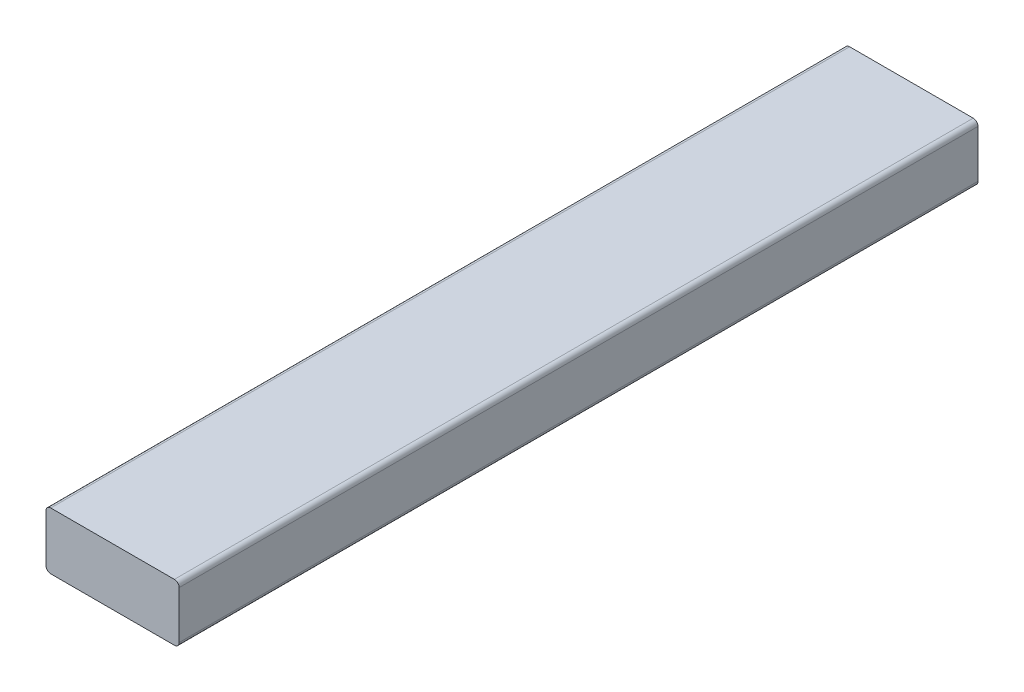
ISO-10303-21;
HEADER;
FILE_DESCRIPTION(('STEP AP214'),'2;1');
FILE_NAME('part.step','',(''),(''),'','','');
FILE_SCHEMA(('AUTOMOTIVE_DESIGN { 1 0 10303 214 1 1 1 1 }'));
ENDSEC;
DATA;
#1=APPLICATION_CONTEXT('core data for automotive mechanical design processes');
#2=APPLICATION_PROTOCOL_DEFINITION('international standard','automotive_design',2000,#1);
#3=PRODUCT_CONTEXT('',#1,'mechanical');
#4=PRODUCT('Part','Part','',(#3));
#5=PRODUCT_RELATED_PRODUCT_CATEGORY('part','',(#4));
#6=PRODUCT_DEFINITION_FORMATION('','',#4);
#7=PRODUCT_DEFINITION_CONTEXT('part definition',#1,'design');
#8=PRODUCT_DEFINITION('design','',#6,#7);
#9=PRODUCT_DEFINITION_SHAPE('','',#8);
#10=(LENGTH_UNIT() NAMED_UNIT(*) SI_UNIT(.MILLI.,.METRE.));
#11=(NAMED_UNIT(*) PLANE_ANGLE_UNIT() SI_UNIT($,.RADIAN.));
#12=(NAMED_UNIT(*) SI_UNIT($,.STERADIAN.) SOLID_ANGLE_UNIT());
#13=UNCERTAINTY_MEASURE_WITH_UNIT(LENGTH_MEASURE(1.E-05),#10,'distance_accuracy_value','');
#14=(GEOMETRIC_REPRESENTATION_CONTEXT(3) GLOBAL_UNCERTAINTY_ASSIGNED_CONTEXT((#13)) GLOBAL_UNIT_ASSIGNED_CONTEXT((#10,
#11,#12)) REPRESENTATION_CONTEXT('',''));
#15=CARTESIAN_POINT('',(0.,0.,0.));
#16=DIRECTION('',(0.,0.,1.));
#17=DIRECTION('',(1.,0.,0.));
#18=AXIS2_PLACEMENT_3D('',#15,#16,#17);
#19=CARTESIAN_POINT('',(44.45,-19.05,533.4));
#20=DIRECTION('',(-1.,0.,0.));
#21=DIRECTION('',(0.,0.,1.));
#22=AXIS2_PLACEMENT_3D('',#19,#20,#21);
#23=PLANE('',#22);
#24=DIRECTION('',(0.,1.,0.));
#25=VECTOR('',#24,1.);
#26=CARTESIAN_POINT('',(44.45,-19.05,533.4));
#27=LINE('',#26,#25);
#28=CARTESIAN_POINT('',(44.45,-15.875,533.4));
#29=VERTEX_POINT('',#28);
#30=CARTESIAN_POINT('',(44.45,15.875,533.4));
#31=VERTEX_POINT('',#30);
#32=EDGE_CURVE('E133',#29,#31,#27,.T.);
#33=ORIENTED_EDGE('',*,*,#32,.F.);
#34=DIRECTION('',(0.,0.,-1.));
#35=VECTOR('',#34,1.);
#36=CARTESIAN_POINT('',(44.45,-15.875,533.4));
#37=LINE('',#36,#35);
#38=CARTESIAN_POINT('',(44.45,-15.875,0.));
#39=VERTEX_POINT('',#38);
#40=EDGE_CURVE('E11',#29,#39,#37,.T.);
#41=ORIENTED_EDGE('',*,*,#40,.T.);
#42=DIRECTION('',(0.,1.,0.));
#43=VECTOR('',#42,1.);
#44=CARTESIAN_POINT('',(44.45,-19.05,0.));
#45=LINE('',#44,#43);
#46=CARTESIAN_POINT('',(44.45,15.875,0.));
#47=VERTEX_POINT('',#46);
#48=EDGE_CURVE('E164',#39,#47,#45,.T.);
#49=ORIENTED_EDGE('',*,*,#48,.T.);
#50=DIRECTION('',(0.,0.,-1.));
#51=VECTOR('',#50,1.);
#52=CARTESIAN_POINT('',(44.45,15.875,533.4));
#53=LINE('',#52,#51);
#54=EDGE_CURVE('E47',#47,#31,#53,.F.);
#55=ORIENTED_EDGE('',*,*,#54,.T.);
#56=EDGE_LOOP('',(#33,#41,#49,#55));
#57=FACE_BOUND('',#56,.T.);
#58=ADVANCED_FACE('F39',(#57),#23,.F.);
#59=CARTESIAN_POINT('',(-44.45,19.05,533.4));
#60=DIRECTION('',(0.,-1.,0.));
#61=DIRECTION('',(0.,0.,-1.));
#62=AXIS2_PLACEMENT_3D('',#59,#60,#61);
#63=PLANE('',#62);
#64=DIRECTION('',(-1.,0.,0.));
#65=VECTOR('',#64,1.);
#66=CARTESIAN_POINT('',(-44.45,19.05,0.));
#67=LINE('',#66,#65);
#68=CARTESIAN_POINT('',(41.275,19.05,0.));
#69=VERTEX_POINT('',#68);
#70=CARTESIAN_POINT('',(-41.275,19.05,0.));
#71=VERTEX_POINT('',#70);
#72=EDGE_CURVE('E138',#69,#71,#67,.T.);
#73=ORIENTED_EDGE('',*,*,#72,.T.);
#74=DIRECTION('',(0.,0.,-1.));
#75=VECTOR('',#74,1.);
#76=CARTESIAN_POINT('',(-41.275,19.05,533.4));
#77=LINE('',#76,#75);
#78=CARTESIAN_POINT('',(-41.275,19.05,533.4));
#79=VERTEX_POINT('',#78);
#80=EDGE_CURVE('E54',#71,#79,#77,.F.);
#81=ORIENTED_EDGE('',*,*,#80,.T.);
#82=DIRECTION('',(-1.,0.,0.));
#83=VECTOR('',#82,1.);
#84=CARTESIAN_POINT('',(-44.45,19.05,533.4));
#85=LINE('',#84,#83);
#86=CARTESIAN_POINT('',(41.275,19.05,533.4));
#87=VERTEX_POINT('',#86);
#88=EDGE_CURVE('E136',#87,#79,#85,.T.);
#89=ORIENTED_EDGE('',*,*,#88,.F.);
#90=DIRECTION('',(0.,0.,-1.));
#91=VECTOR('',#90,1.);
#92=CARTESIAN_POINT('',(41.275,19.05,533.4));
#93=LINE('',#92,#91);
#94=EDGE_CURVE('E156',#87,#69,#93,.T.);
#95=ORIENTED_EDGE('',*,*,#94,.T.);
#96=EDGE_LOOP('',(#73,#81,#89,#95));
#97=FACE_BOUND('',#96,.T.);
#98=ADVANCED_FACE('F171',(#97),#63,.F.);
#99=CARTESIAN_POINT('',(-44.45,-19.05,533.4));
#100=DIRECTION('',(1.,0.,0.));
#101=DIRECTION('',(0.,0.,-1.));
#102=AXIS2_PLACEMENT_3D('',#99,#100,#101);
#103=PLANE('',#102);
#104=DIRECTION('',(0.,-1.,0.));
#105=VECTOR('',#104,1.);
#106=CARTESIAN_POINT('',(-44.45,-19.05,0.));
#107=LINE('',#106,#105);
#108=CARTESIAN_POINT('',(-44.45,15.875,0.));
#109=VERTEX_POINT('',#108);
#110=CARTESIAN_POINT('',(-44.45,-15.875,0.));
#111=VERTEX_POINT('',#110);
#112=EDGE_CURVE('E134',#109,#111,#107,.T.);
#113=ORIENTED_EDGE('',*,*,#112,.T.);
#114=DIRECTION('',(0.,0.,-1.));
#115=VECTOR('',#114,1.);
#116=CARTESIAN_POINT('',(-44.45,-15.875,533.4));
#117=LINE('',#116,#115);
#118=CARTESIAN_POINT('',(-44.45,-15.875,533.4));
#119=VERTEX_POINT('',#118);
#120=EDGE_CURVE('E111',#111,#119,#117,.F.);
#121=ORIENTED_EDGE('',*,*,#120,.T.);
#122=DIRECTION('',(0.,-1.,0.));
#123=VECTOR('',#122,1.);
#124=CARTESIAN_POINT('',(-44.45,-19.05,533.4));
#125=LINE('',#124,#123);
#126=CARTESIAN_POINT('',(-44.45,15.875,533.4));
#127=VERTEX_POINT('',#126);
#128=EDGE_CURVE('E175',#127,#119,#125,.T.);
#129=ORIENTED_EDGE('',*,*,#128,.F.);
#130=DIRECTION('',(0.,0.,-1.));
#131=VECTOR('',#130,1.);
#132=CARTESIAN_POINT('',(-44.45,15.875,533.4));
#133=LINE('',#132,#131);
#134=EDGE_CURVE('E116',#127,#109,#133,.T.);
#135=ORIENTED_EDGE('',*,*,#134,.T.);
#136=EDGE_LOOP('',(#113,#121,#129,#135));
#137=FACE_BOUND('',#136,.T.);
#138=ADVANCED_FACE('F183',(#137),#103,.F.);
#139=CARTESIAN_POINT('',(-44.45,-19.05,533.4));
#140=DIRECTION('',(0.,1.,0.));
#141=DIRECTION('',(0.,0.,1.));
#142=AXIS2_PLACEMENT_3D('',#139,#140,#141);
#143=PLANE('',#142);
#144=DIRECTION('',(1.,0.,0.));
#145=VECTOR('',#144,1.);
#146=CARTESIAN_POINT('',(-44.45,-19.05,533.4));
#147=LINE('',#146,#145);
#148=CARTESIAN_POINT('',(-41.275,-19.05,533.4));
#149=VERTEX_POINT('',#148);
#150=CARTESIAN_POINT('',(41.275,-19.05,533.4));
#151=VERTEX_POINT('',#150);
#152=EDGE_CURVE('E126',#149,#151,#147,.T.);
#153=ORIENTED_EDGE('',*,*,#152,.F.);
#154=DIRECTION('',(0.,0.,-1.));
#155=VECTOR('',#154,1.);
#156=CARTESIAN_POINT('',(-41.275,-19.05,533.4));
#157=LINE('',#156,#155);
#158=CARTESIAN_POINT('',(-41.275,-19.05,0.));
#159=VERTEX_POINT('',#158);
#160=EDGE_CURVE('E110',#149,#159,#157,.T.);
#161=ORIENTED_EDGE('',*,*,#160,.T.);
#162=DIRECTION('',(1.,0.,0.));
#163=VECTOR('',#162,1.);
#164=CARTESIAN_POINT('',(-44.45,-19.05,0.));
#165=LINE('',#164,#163);
#166=CARTESIAN_POINT('',(41.275,-19.05,0.));
#167=VERTEX_POINT('',#166);
#168=EDGE_CURVE('E123',#159,#167,#165,.T.);
#169=ORIENTED_EDGE('',*,*,#168,.T.);
#170=DIRECTION('',(0.,0.,-1.));
#171=VECTOR('',#170,1.);
#172=CARTESIAN_POINT('',(41.275,-19.05,533.4));
#173=LINE('',#172,#171);
#174=EDGE_CURVE('E128',#167,#151,#173,.F.);
#175=ORIENTED_EDGE('',*,*,#174,.T.);
#176=EDGE_LOOP('',(#153,#161,#169,#175));
#177=FACE_BOUND('',#176,.T.);
#178=ADVANCED_FACE('F122',(#177),#143,.F.);
#179=CARTESIAN_POINT('',(0.,0.,533.4));
#180=DIRECTION('',(0.,0.,-1.));
#181=DIRECTION('',(-1.,0.,0.));
#182=AXIS2_PLACEMENT_3D('',#179,#180,#181);
#183=PLANE('',#182);
#184=ORIENTED_EDGE('',*,*,#128,.T.);
#185=CARTESIAN_POINT('',(-41.275,-15.875,533.4));
#186=DIRECTION('',(0.,0.,-1.));
#187=DIRECTION('',(-1.,0.,0.));
#188=AXIS2_PLACEMENT_3D('',#185,#186,#187);
#189=CIRCLE('',#188,3.175);
#190=EDGE_CURVE('E154',#119,#149,#189,.F.);
#191=ORIENTED_EDGE('',*,*,#190,.T.);
#192=ORIENTED_EDGE('',*,*,#152,.T.);
#193=CARTESIAN_POINT('',(41.275,-15.875,533.4));
#194=DIRECTION('',(0.,0.,-1.));
#195=DIRECTION('',(-1.,0.,0.));
#196=AXIS2_PLACEMENT_3D('',#193,#194,#195);
#197=CIRCLE('',#196,3.175);
#198=EDGE_CURVE('E150',#151,#29,#197,.F.);
#199=ORIENTED_EDGE('',*,*,#198,.T.);
#200=ORIENTED_EDGE('',*,*,#32,.T.);
#201=CARTESIAN_POINT('',(41.275,15.875,533.4));
#202=DIRECTION('',(0.,0.,-1.));
#203=DIRECTION('',(-1.,0.,0.));
#204=AXIS2_PLACEMENT_3D('',#201,#202,#203);
#205=CIRCLE('',#204,3.175);
#206=EDGE_CURVE('E61',#31,#87,#205,.F.);
#207=ORIENTED_EDGE('',*,*,#206,.T.);
#208=ORIENTED_EDGE('',*,*,#88,.T.);
#209=CARTESIAN_POINT('',(-41.275,15.875,533.4));
#210=DIRECTION('',(0.,0.,-1.));
#211=DIRECTION('',(-1.,0.,0.));
#212=AXIS2_PLACEMENT_3D('',#209,#210,#211);
#213=CIRCLE('',#212,3.175);
#214=EDGE_CURVE('E152',#79,#127,#213,.F.);
#215=ORIENTED_EDGE('',*,*,#214,.T.);
#216=EDGE_LOOP('',(#184,#191,#192,#199,#200,#207,#208,#215));
#217=FACE_BOUND('',#216,.T.);
#218=ADVANCED_FACE('F167',(#217),#183,.F.);
#219=CARTESIAN_POINT('',(0.,0.,0.));
#220=DIRECTION('',(0.,0.,-1.));
#221=DIRECTION('',(-1.,0.,0.));
#222=AXIS2_PLACEMENT_3D('',#219,#220,#221);
#223=PLANE('',#222);
#224=ORIENTED_EDGE('',*,*,#168,.F.);
#225=CARTESIAN_POINT('',(-41.275,-15.875,0.));
#226=DIRECTION('',(0.,0.,-1.));
#227=DIRECTION('',(-1.,0.,0.));
#228=AXIS2_PLACEMENT_3D('',#225,#226,#227);
#229=CIRCLE('',#228,3.175);
#230=EDGE_CURVE('E106',#159,#111,#229,.T.);
#231=ORIENTED_EDGE('',*,*,#230,.T.);
#232=ORIENTED_EDGE('',*,*,#112,.F.);
#233=CARTESIAN_POINT('',(-41.275,15.875,0.));
#234=DIRECTION('',(0.,0.,-1.));
#235=DIRECTION('',(-1.,0.,0.));
#236=AXIS2_PLACEMENT_3D('',#233,#234,#235);
#237=CIRCLE('',#236,3.175);
#238=EDGE_CURVE('E117',#109,#71,#237,.T.);
#239=ORIENTED_EDGE('',*,*,#238,.T.);
#240=ORIENTED_EDGE('',*,*,#72,.F.);
#241=CARTESIAN_POINT('',(41.275,15.875,0.));
#242=DIRECTION('',(0.,0.,-1.));
#243=DIRECTION('',(-1.,0.,0.));
#244=AXIS2_PLACEMENT_3D('',#241,#242,#243);
#245=CIRCLE('',#244,3.175);
#246=EDGE_CURVE('E127',#69,#47,#245,.T.);
#247=ORIENTED_EDGE('',*,*,#246,.T.);
#248=ORIENTED_EDGE('',*,*,#48,.F.);
#249=CARTESIAN_POINT('',(41.275,-15.875,0.));
#250=DIRECTION('',(0.,0.,-1.));
#251=DIRECTION('',(-1.,0.,0.));
#252=AXIS2_PLACEMENT_3D('',#249,#250,#251);
#253=CIRCLE('',#252,3.175);
#254=EDGE_CURVE('E132',#39,#167,#253,.T.);
#255=ORIENTED_EDGE('',*,*,#254,.T.);
#256=EDGE_LOOP('',(#224,#231,#232,#239,#240,#247,#248,#255));
#257=FACE_BOUND('',#256,.T.);
#258=ADVANCED_FACE('F130',(#257),#223,.T.);
#259=CARTESIAN_POINT('',(-41.275,-15.875,533.4));
#260=DIRECTION('',(0.,0.,-1.));
#261=DIRECTION('',(-1.,0.,0.));
#262=AXIS2_PLACEMENT_3D('',#259,#260,#261);
#263=CYLINDRICAL_SURFACE('',#262,3.175);
#264=ORIENTED_EDGE('',*,*,#190,.F.);
#265=ORIENTED_EDGE('',*,*,#120,.F.);
#266=ORIENTED_EDGE('',*,*,#230,.F.);
#267=ORIENTED_EDGE('',*,*,#160,.F.);
#268=EDGE_LOOP('',(#264,#265,#266,#267));
#269=FACE_BOUND('',#268,.T.);
#270=ADVANCED_FACE('F109',(#269),#263,.T.);
#271=CARTESIAN_POINT('',(-41.275,15.875,533.4));
#272=DIRECTION('',(0.,0.,-1.));
#273=DIRECTION('',(-1.,0.,0.));
#274=AXIS2_PLACEMENT_3D('',#271,#272,#273);
#275=CYLINDRICAL_SURFACE('',#274,3.175);
#276=ORIENTED_EDGE('',*,*,#214,.F.);
#277=ORIENTED_EDGE('',*,*,#80,.F.);
#278=ORIENTED_EDGE('',*,*,#238,.F.);
#279=ORIENTED_EDGE('',*,*,#134,.F.);
#280=EDGE_LOOP('',(#276,#277,#278,#279));
#281=FACE_BOUND('',#280,.T.);
#282=ADVANCED_FACE('F181',(#281),#275,.T.);
#283=CARTESIAN_POINT('',(41.275,-15.875,533.4));
#284=DIRECTION('',(0.,0.,-1.));
#285=DIRECTION('',(-1.,0.,0.));
#286=AXIS2_PLACEMENT_3D('',#283,#284,#285);
#287=CYLINDRICAL_SURFACE('',#286,3.175);
#288=ORIENTED_EDGE('',*,*,#198,.F.);
#289=ORIENTED_EDGE('',*,*,#174,.F.);
#290=ORIENTED_EDGE('',*,*,#254,.F.);
#291=ORIENTED_EDGE('',*,*,#40,.F.);
#292=EDGE_LOOP('',(#288,#289,#290,#291));
#293=FACE_BOUND('',#292,.T.);
#294=ADVANCED_FACE('F185',(#293),#287,.T.);
#295=CARTESIAN_POINT('',(41.275,15.875,533.4));
#296=DIRECTION('',(0.,0.,-1.));
#297=DIRECTION('',(-1.,0.,0.));
#298=AXIS2_PLACEMENT_3D('',#295,#296,#297);
#299=CYLINDRICAL_SURFACE('',#298,3.175);
#300=ORIENTED_EDGE('',*,*,#206,.F.);
#301=ORIENTED_EDGE('',*,*,#54,.F.);
#302=ORIENTED_EDGE('',*,*,#246,.F.);
#303=ORIENTED_EDGE('',*,*,#94,.F.);
#304=EDGE_LOOP('',(#300,#301,#302,#303));
#305=FACE_BOUND('',#304,.T.);
#306=ADVANCED_FACE('F41',(#305),#299,.T.);
#307=CLOSED_SHELL('',(#58,#98,#138,#178,#218,#258,#270,#282,#294,#306));
#308=MANIFOLD_SOLID_BREP('B2',#307);
#309=ADVANCED_BREP_SHAPE_REPRESENTATION('',(#18,#308),#14);
#310=SHAPE_DEFINITION_REPRESENTATION(#9,#309);
ENDSEC;
END-ISO-10303-21;
